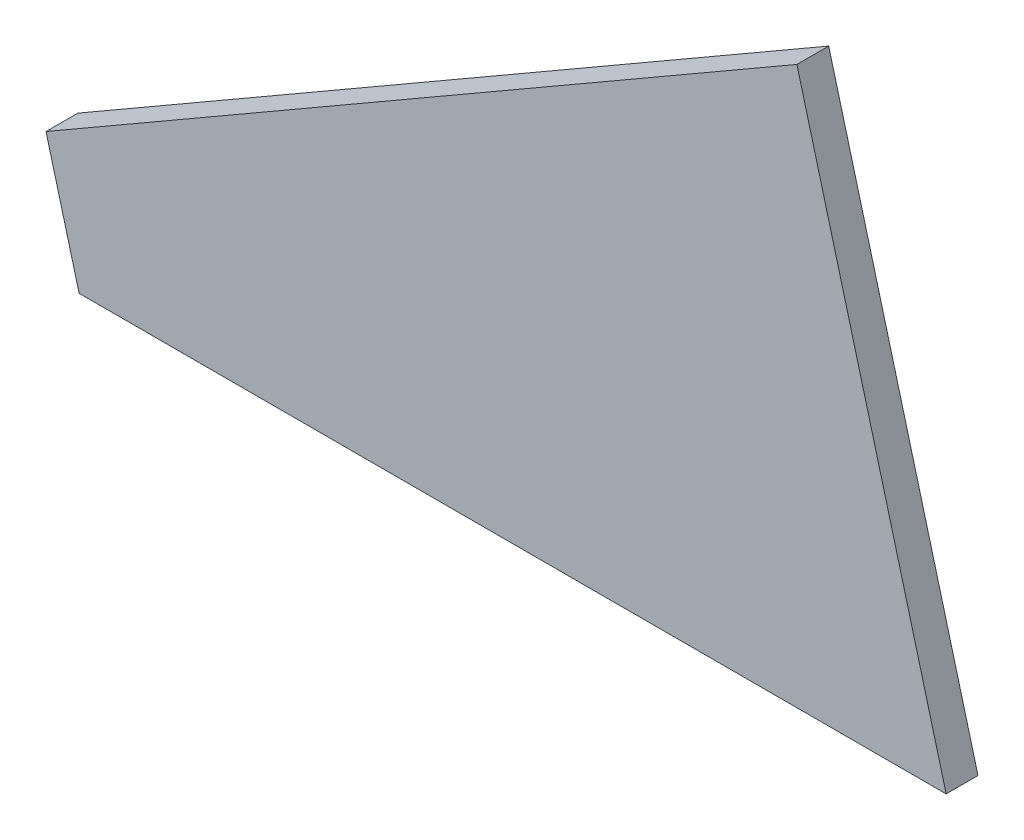
ISO-10303-21;
HEADER;
FILE_DESCRIPTION(('STEP AP214'),'2;1');
FILE_NAME('part.step','',(''),(''),'','','');
FILE_SCHEMA(('AUTOMOTIVE_DESIGN { 1 0 10303 214 1 1 1 1 }'));
ENDSEC;
DATA;
#1=APPLICATION_CONTEXT('core data for automotive mechanical design processes');
#2=APPLICATION_PROTOCOL_DEFINITION('international standard','automotive_design',2000,#1);
#3=PRODUCT_CONTEXT('',#1,'mechanical');
#4=PRODUCT('Part','Part','',(#3));
#5=PRODUCT_RELATED_PRODUCT_CATEGORY('part','',(#4));
#6=PRODUCT_DEFINITION_FORMATION('','',#4);
#7=PRODUCT_DEFINITION_CONTEXT('part definition',#1,'design');
#8=PRODUCT_DEFINITION('design','',#6,#7);
#9=PRODUCT_DEFINITION_SHAPE('','',#8);
#10=(LENGTH_UNIT() NAMED_UNIT(*) SI_UNIT(.MILLI.,.METRE.));
#11=(NAMED_UNIT(*) PLANE_ANGLE_UNIT() SI_UNIT($,.RADIAN.));
#12=(NAMED_UNIT(*) SI_UNIT($,.STERADIAN.) SOLID_ANGLE_UNIT());
#13=UNCERTAINTY_MEASURE_WITH_UNIT(LENGTH_MEASURE(1.E-05),#10,'distance_accuracy_value','');
#14=(GEOMETRIC_REPRESENTATION_CONTEXT(3) GLOBAL_UNCERTAINTY_ASSIGNED_CONTEXT((#13)) GLOBAL_UNIT_ASSIGNED_CONTEXT((#10,
#11,#12)) REPRESENTATION_CONTEXT('',''));
#15=CARTESIAN_POINT('',(0.,0.,0.));
#16=DIRECTION('',(0.,0.,1.));
#17=DIRECTION('',(1.,0.,0.));
#18=AXIS2_PLACEMENT_3D('',#15,#16,#17);
#19=CARTESIAN_POINT('',(14.4896872603862,3.88249999999999,2.));
#20=DIRECTION('',(-0.965925826289069,-0.258819045102521,0.));
#21=DIRECTION('',(0.25881904510252,-0.965925826289068,0.));
#22=AXIS2_PLACEMENT_3D('',#19,#20,#21);
#23=PLANE('',#22);
#24=DIRECTION('',(-0.25881904510252,0.965925826289068,0.));
#25=VECTOR('',#24,1.);
#26=CARTESIAN_POINT('',(14.4896872603862,3.88249999999999,0.));
#27=LINE('',#26,#25);
#28=CARTESIAN_POINT('',(15.53,0.,0.));
#29=VERTEX_POINT('',#28);
#30=CARTESIAN_POINT('',(13.4493745207723,7.765,0.));
#31=VERTEX_POINT('',#30);
#32=EDGE_CURVE('E99',#29,#31,#27,.T.);
#33=ORIENTED_EDGE('',*,*,#32,.F.);
#34=DIRECTION('',(0.,0.,-1.));
#35=VECTOR('',#34,1.);
#36=CARTESIAN_POINT('',(15.53,0.,2.));
#37=LINE('',#36,#35);
#38=CARTESIAN_POINT('',(15.53,0.,2.));
#39=VERTEX_POINT('',#38);
#40=EDGE_CURVE('E11',#39,#29,#37,.T.);
#41=ORIENTED_EDGE('',*,*,#40,.F.);
#42=DIRECTION('',(-0.25881904510252,0.965925826289068,0.));
#43=VECTOR('',#42,1.);
#44=CARTESIAN_POINT('',(14.4896872603862,3.88249999999999,2.));
#45=LINE('',#44,#43);
#46=CARTESIAN_POINT('',(13.4493745207723,7.765,2.));
#47=VERTEX_POINT('',#46);
#48=EDGE_CURVE('E84',#39,#47,#45,.T.);
#49=ORIENTED_EDGE('',*,*,#48,.T.);
#50=DIRECTION('',(0.,0.,-1.));
#51=VECTOR('',#50,1.);
#52=CARTESIAN_POINT('',(13.4493745207723,7.765,2.));
#53=LINE('',#52,#51);
#54=EDGE_CURVE('E52',#47,#31,#53,.T.);
#55=ORIENTED_EDGE('',*,*,#54,.T.);
#56=EDGE_LOOP('',(#33,#41,#49,#55));
#57=FACE_BOUND('',#56,.T.);
#58=ADVANCED_FACE('F36',(#57),#23,.T.);
#59=CARTESIAN_POINT('',(0.,0.,2.));
#60=DIRECTION('',(0.,1.,0.));
#61=DIRECTION('',(0.,0.,1.));
#62=AXIS2_PLACEMENT_3D('',#59,#60,#61);
#63=PLANE('',#62);
#64=DIRECTION('',(1.,0.,0.));
#65=VECTOR('',#64,1.);
#66=CARTESIAN_POINT('',(0.,0.,0.));
#67=LINE('',#66,#65);
#68=CARTESIAN_POINT('',(70.,0.,0.));
#69=VERTEX_POINT('',#68);
#70=EDGE_CURVE('E90',#29,#69,#67,.T.);
#71=ORIENTED_EDGE('',*,*,#70,.T.);
#72=DIRECTION('',(0.,0.,-1.));
#73=VECTOR('',#72,1.);
#74=CARTESIAN_POINT('',(70.,0.,2.));
#75=LINE('',#74,#73);
#76=CARTESIAN_POINT('',(70.,0.,2.));
#77=VERTEX_POINT('',#76);
#78=EDGE_CURVE('E44',#77,#69,#75,.T.);
#79=ORIENTED_EDGE('',*,*,#78,.F.);
#80=DIRECTION('',(1.,0.,0.));
#81=VECTOR('',#80,1.);
#82=CARTESIAN_POINT('',(0.,0.,2.));
#83=LINE('',#82,#81);
#84=EDGE_CURVE('E78',#39,#77,#83,.T.);
#85=ORIENTED_EDGE('',*,*,#84,.F.);
#86=ORIENTED_EDGE('',*,*,#40,.T.);
#87=EDGE_LOOP('',(#71,#79,#85,#86));
#88=FACE_BOUND('',#87,.T.);
#89=ADVANCED_FACE('F88',(#88),#63,.F.);
#90=CARTESIAN_POINT('',(65.3108891324554,17.5,2.));
#91=DIRECTION('',(-0.965925826289068,-0.258819045102521,0.));
#92=DIRECTION('',(0.258819045102521,-0.965925826289068,0.));
#93=AXIS2_PLACEMENT_3D('',#90,#91,#92);
#94=PLANE('',#93);
#95=DIRECTION('',(-0.258819045102521,0.965925826289068,0.));
#96=VECTOR('',#95,1.);
#97=CARTESIAN_POINT('',(65.3108891324554,17.5,0.));
#98=LINE('',#97,#96);
#99=CARTESIAN_POINT('',(60.6217782649107,35.,0.));
#100=VERTEX_POINT('',#99);
#101=EDGE_CURVE('E102',#69,#100,#98,.T.);
#102=ORIENTED_EDGE('',*,*,#101,.T.);
#103=DIRECTION('',(0.,0.,-1.));
#104=VECTOR('',#103,1.);
#105=CARTESIAN_POINT('',(60.6217782649107,35.,2.));
#106=LINE('',#105,#104);
#107=CARTESIAN_POINT('',(60.6217782649107,35.,2.));
#108=VERTEX_POINT('',#107);
#109=EDGE_CURVE('E66',#108,#100,#106,.T.);
#110=ORIENTED_EDGE('',*,*,#109,.F.);
#111=DIRECTION('',(-0.258819045102521,0.965925826289068,0.));
#112=VECTOR('',#111,1.);
#113=CARTESIAN_POINT('',(65.3108891324554,17.5,2.));
#114=LINE('',#113,#112);
#115=EDGE_CURVE('E83',#77,#108,#114,.T.);
#116=ORIENTED_EDGE('',*,*,#115,.F.);
#117=ORIENTED_EDGE('',*,*,#78,.T.);
#118=EDGE_LOOP('',(#102,#110,#116,#117));
#119=FACE_BOUND('',#118,.T.);
#120=ADVANCED_FACE('F93',(#119),#94,.F.);
#121=CARTESIAN_POINT('',(0.,0.,2.));
#122=DIRECTION('',(-0.5,0.866025403784439,0.));
#123=DIRECTION('',(-0.866025403784439,-0.5,0.));
#124=AXIS2_PLACEMENT_3D('',#121,#122,#123);
#125=PLANE('',#124);
#126=DIRECTION('',(0.866025403784439,0.5,0.));
#127=VECTOR('',#126,1.);
#128=CARTESIAN_POINT('',(0.,0.,0.));
#129=LINE('',#128,#127);
#130=EDGE_CURVE('E104',#31,#100,#129,.T.);
#131=ORIENTED_EDGE('',*,*,#130,.F.);
#132=ORIENTED_EDGE('',*,*,#54,.F.);
#133=DIRECTION('',(0.866025403784439,0.5,0.));
#134=VECTOR('',#133,1.);
#135=CARTESIAN_POINT('',(0.,0.,2.));
#136=LINE('',#135,#134);
#137=EDGE_CURVE('E94',#47,#108,#136,.T.);
#138=ORIENTED_EDGE('',*,*,#137,.T.);
#139=ORIENTED_EDGE('',*,*,#109,.T.);
#140=EDGE_LOOP('',(#131,#132,#138,#139));
#141=FACE_BOUND('',#140,.T.);
#142=ADVANCED_FACE('F109',(#141),#125,.T.);
#143=CARTESIAN_POINT('',(0.,0.,2.));
#144=DIRECTION('',(0.,0.,1.));
#145=DIRECTION('',(1.,0.,0.));
#146=AXIS2_PLACEMENT_3D('',#143,#144,#145);
#147=PLANE('',#146);
#148=ORIENTED_EDGE('',*,*,#48,.F.);
#149=ORIENTED_EDGE('',*,*,#84,.T.);
#150=ORIENTED_EDGE('',*,*,#115,.T.);
#151=ORIENTED_EDGE('',*,*,#137,.F.);
#152=EDGE_LOOP('',(#148,#149,#150,#151));
#153=FACE_BOUND('',#152,.T.);
#154=ADVANCED_FACE('F80',(#153),#147,.T.);
#155=CARTESIAN_POINT('',(0.,0.,0.));
#156=DIRECTION('',(0.,0.,1.));
#157=DIRECTION('',(1.,0.,0.));
#158=AXIS2_PLACEMENT_3D('',#155,#156,#157);
#159=PLANE('',#158);
#160=ORIENTED_EDGE('',*,*,#32,.T.);
#161=ORIENTED_EDGE('',*,*,#130,.T.);
#162=ORIENTED_EDGE('',*,*,#101,.F.);
#163=ORIENTED_EDGE('',*,*,#70,.F.);
#164=EDGE_LOOP('',(#160,#161,#162,#163));
#165=FACE_BOUND('',#164,.T.);
#166=ADVANCED_FACE('F116',(#165),#159,.F.);
#167=CLOSED_SHELL('',(#58,#89,#120,#142,#154,#166));
#168=MANIFOLD_SOLID_BREP('B2',#167);
#169=ADVANCED_BREP_SHAPE_REPRESENTATION('',(#18,#168),#14);
#170=SHAPE_DEFINITION_REPRESENTATION(#9,#169);
ENDSEC;
END-ISO-10303-21;
